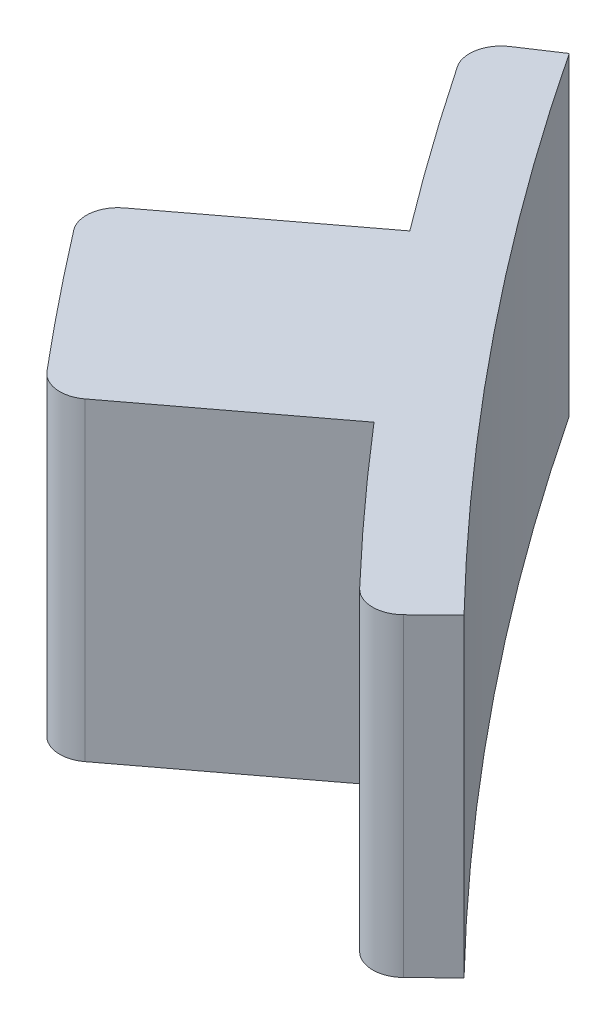
ISO-10303-21;
HEADER;
FILE_DESCRIPTION(('STEP AP214'),'2;1');
FILE_NAME('part.step','',(''),(''),'','','');
FILE_SCHEMA(('AUTOMOTIVE_DESIGN { 1 0 10303 214 1 1 1 1 }'));
ENDSEC;
DATA;
#1=APPLICATION_CONTEXT('core data for automotive mechanical design processes');
#2=APPLICATION_PROTOCOL_DEFINITION('international standard','automotive_design',2000,#1);
#3=PRODUCT_CONTEXT('',#1,'mechanical');
#4=PRODUCT('Part','Part','',(#3));
#5=PRODUCT_RELATED_PRODUCT_CATEGORY('part','',(#4));
#6=PRODUCT_DEFINITION_FORMATION('','',#4);
#7=PRODUCT_DEFINITION_CONTEXT('part definition',#1,'design');
#8=PRODUCT_DEFINITION('design','',#6,#7);
#9=PRODUCT_DEFINITION_SHAPE('','',#8);
#10=(LENGTH_UNIT() NAMED_UNIT(*) SI_UNIT(.MILLI.,.METRE.));
#11=(NAMED_UNIT(*) PLANE_ANGLE_UNIT() SI_UNIT($,.RADIAN.));
#12=(NAMED_UNIT(*) SI_UNIT($,.STERADIAN.) SOLID_ANGLE_UNIT());
#13=UNCERTAINTY_MEASURE_WITH_UNIT(LENGTH_MEASURE(1.E-05),#10,'distance_accuracy_value','');
#14=(GEOMETRIC_REPRESENTATION_CONTEXT(3) GLOBAL_UNCERTAINTY_ASSIGNED_CONTEXT((#13)) GLOBAL_UNIT_ASSIGNED_CONTEXT((#10,
#11,#12)) REPRESENTATION_CONTEXT('',''));
#15=CARTESIAN_POINT('',(0.,0.,0.));
#16=DIRECTION('',(0.,0.,1.));
#17=DIRECTION('',(1.,0.,0.));
#18=AXIS2_PLACEMENT_3D('',#15,#16,#17);
#19=CARTESIAN_POINT('',(1.68481362004538E-13,25.4,2.54615474717147E-13));
#20=DIRECTION('',(-0.551834617558189,0.,-0.833953568770113));
#21=DIRECTION('',(-0.833953568770113,0.,0.551834617558189));
#22=AXIS2_PLACEMENT_3D('',#19,#20,#21);
#23=PLANE('',#22);
#24=DIRECTION('',(0.833953568770113,0.,-0.551834617558189));
#25=VECTOR('',#24,1.);
#26=CARTESIAN_POINT('',(1.68481362004538E-13,0.,2.54615474717147E-13));
#27=LINE('',#26,#25);
#28=CARTESIAN_POINT('',(-253.720621889202,0.,167.889229796497));
#29=VERTEX_POINT('',#28);
#30=CARTESIAN_POINT('',(-250.831084414924,0.,165.977196720855));
#31=VERTEX_POINT('',#30);
#32=EDGE_CURVE('E164',#29,#31,#27,.T.);
#33=ORIENTED_EDGE('',*,*,#32,.F.);
#34=DIRECTION('',(0.,1.,0.));
#35=VECTOR('',#34,1.);
#36=CARTESIAN_POINT('',(-253.720621889202,25.4,167.889229796497));
#37=LINE('',#36,#35);
#38=CARTESIAN_POINT('',(-253.720621889202,25.4,167.889229796497));
#39=VERTEX_POINT('',#38);
#40=EDGE_CURVE('E208',#29,#39,#37,.T.);
#41=ORIENTED_EDGE('',*,*,#40,.T.);
#42=DIRECTION('',(0.833953568770113,0.,-0.551834617558189));
#43=VECTOR('',#42,1.);
#44=CARTESIAN_POINT('',(1.68481362004538E-13,25.4,2.54615474717147E-13));
#45=LINE('',#44,#43);
#46=CARTESIAN_POINT('',(-250.831084414924,25.4,165.977196720855));
#47=VERTEX_POINT('',#46);
#48=EDGE_CURVE('E133',#39,#47,#45,.T.);
#49=ORIENTED_EDGE('',*,*,#48,.T.);
#50=DIRECTION('',(0.,-1.,0.));
#51=VECTOR('',#50,1.);
#52=CARTESIAN_POINT('',(-250.831084414924,25.4,165.977196720855));
#53=LINE('',#52,#51);
#54=EDGE_CURVE('E163',#47,#31,#53,.T.);
#55=ORIENTED_EDGE('',*,*,#54,.T.);
#56=EDGE_LOOP('',(#33,#41,#49,#55));
#57=FACE_BOUND('',#56,.T.);
#58=ADVANCED_FACE('F32',(#57),#23,.T.);
#59=CARTESIAN_POINT('',(0.,25.4,0.));
#60=DIRECTION('',(0.,-1.,0.));
#61=DIRECTION('',(0.,0.,-1.));
#62=AXIS2_PLACEMENT_3D('',#59,#60,#61);
#63=CYLINDRICAL_SURFACE('',#62,306.788909699779);
#64=CARTESIAN_POINT('',(0.,25.4,0.));
#65=DIRECTION('',(0.,1.,0.));
#66=DIRECTION('',(0.,0.,1.));
#67=AXIS2_PLACEMENT_3D('',#64,#65,#66);
#68=CIRCLE('',#67,306.788909699779);
#69=CARTESIAN_POINT('',(-254.42542855078,25.4,171.426766934255));
#70=VERTEX_POINT('',#69);
#71=CARTESIAN_POINT('',(-244.848924973959,25.4,184.847069367831));
#72=VERTEX_POINT('',#71);
#73=EDGE_CURVE('E120',#70,#72,#68,.T.);
#74=ORIENTED_EDGE('',*,*,#73,.F.);
#75=DIRECTION('',(0.,-1.,0.));
#76=VECTOR('',#75,1.);
#77=CARTESIAN_POINT('',(-254.42542855078,25.4,171.426766934255));
#78=LINE('',#77,#76);
#79=CARTESIAN_POINT('',(-254.42542855078,0.,171.426766934255));
#80=VERTEX_POINT('',#79);
#81=EDGE_CURVE('E206',#70,#80,#78,.T.);
#82=ORIENTED_EDGE('',*,*,#81,.T.);
#83=CARTESIAN_POINT('',(0.,0.,0.));
#84=DIRECTION('',(0.,1.,0.));
#85=DIRECTION('',(0.,0.,1.));
#86=AXIS2_PLACEMENT_3D('',#83,#84,#85);
#87=CIRCLE('',#86,306.788909699779);
#88=CARTESIAN_POINT('',(-244.848924973959,0.,184.847069367831));
#89=VERTEX_POINT('',#88);
#90=EDGE_CURVE('E139',#80,#89,#87,.T.);
#91=ORIENTED_EDGE('',*,*,#90,.T.);
#92=DIRECTION('',(0.,-1.,0.));
#93=VECTOR('',#92,1.);
#94=CARTESIAN_POINT('',(-244.848924973959,25.4,184.847069367831));
#95=LINE('',#94,#93);
#96=EDGE_CURVE('E136',#72,#89,#95,.T.);
#97=ORIENTED_EDGE('',*,*,#96,.F.);
#98=EDGE_LOOP('',(#74,#82,#91,#97));
#99=FACE_BOUND('',#98,.T.);
#100=ADVANCED_FACE('F137',(#99),#63,.T.);
#101=CARTESIAN_POINT('',(0.,25.4,0.));
#102=DIRECTION('',(0.602522006250881,0.,0.798102269125589));
#103=DIRECTION('',(0.798102269125589,0.,-0.602522006250881));
#104=AXIS2_PLACEMENT_3D('',#101,#102,#103);
#105=PLANE('',#104);
#106=DIRECTION('',(-0.798102269125589,0.,0.602522006250881));
#107=VECTOR('',#106,1.);
#108=CARTESIAN_POINT('',(0.,0.,0.));
#109=LINE('',#108,#107);
#110=CARTESIAN_POINT('',(-258.016819612122,0.,194.788083950059));
#111=VERTEX_POINT('',#110);
#112=EDGE_CURVE('E167',#89,#111,#109,.T.);
#113=ORIENTED_EDGE('',*,*,#112,.T.);
#114=DIRECTION('',(0.,-1.,0.));
#115=VECTOR('',#114,1.);
#116=CARTESIAN_POINT('',(-258.016819612122,25.4,194.788083950059));
#117=LINE('',#116,#115);
#118=CARTESIAN_POINT('',(-258.016819612122,25.4,194.788083950059));
#119=VERTEX_POINT('',#118);
#120=EDGE_CURVE('E11',#111,#119,#117,.F.);
#121=ORIENTED_EDGE('',*,*,#120,.T.);
#122=DIRECTION('',(-0.798102269125589,0.,0.602522006250881));
#123=VECTOR('',#122,1.);
#124=CARTESIAN_POINT('',(0.,25.4,0.));
#125=LINE('',#124,#123);
#126=EDGE_CURVE('E125',#72,#119,#125,.T.);
#127=ORIENTED_EDGE('',*,*,#126,.F.);
#128=ORIENTED_EDGE('',*,*,#96,.T.);
#129=EDGE_LOOP('',(#113,#121,#127,#128));
#130=FACE_BOUND('',#129,.T.);
#131=ADVANCED_FACE('F146',(#130),#105,.F.);
#132=CARTESIAN_POINT('',(0.,25.4,0.));
#133=DIRECTION('',(0.,-1.,0.));
#134=DIRECTION('',(0.,0.,-1.));
#135=AXIS2_PLACEMENT_3D('',#132,#133,#134);
#136=CYLINDRICAL_SURFACE('',#135,325.837894288981);
#137=CARTESIAN_POINT('',(0.,0.,0.));
#138=DIRECTION('',(0.,1.,0.));
#139=DIRECTION('',(0.,0.,1.));
#140=AXIS2_PLACEMENT_3D('',#137,#138,#139);
#141=CIRCLE('',#140,325.837894288981);
#142=CARTESIAN_POINT('',(-258.501507233238,0.,198.361548977673));
#143=VERTEX_POINT('',#142);
#144=CARTESIAN_POINT('',(-249.693891681859,0.,209.340139035603));
#145=VERTEX_POINT('',#144);
#146=EDGE_CURVE('E169',#143,#145,#141,.T.);
#147=ORIENTED_EDGE('',*,*,#146,.T.);
#148=DIRECTION('',(0.,-1.,0.));
#149=VECTOR('',#148,1.);
#150=CARTESIAN_POINT('',(-249.693891681859,25.4,209.340139035603));
#151=LINE('',#150,#149);
#152=CARTESIAN_POINT('',(-249.693891681859,25.4,209.340139035603));
#153=VERTEX_POINT('',#152);
#154=EDGE_CURVE('E40',#145,#153,#151,.F.);
#155=ORIENTED_EDGE('',*,*,#154,.T.);
#156=CARTESIAN_POINT('',(0.,25.4,0.));
#157=DIRECTION('',(0.,1.,0.));
#158=DIRECTION('',(0.,0.,1.));
#159=AXIS2_PLACEMENT_3D('',#156,#157,#158);
#160=CIRCLE('',#159,325.837894288981);
#161=CARTESIAN_POINT('',(-258.501507233238,25.4,198.361548977673));
#162=VERTEX_POINT('',#161);
#163=EDGE_CURVE('E148',#162,#153,#160,.T.);
#164=ORIENTED_EDGE('',*,*,#163,.F.);
#165=DIRECTION('',(0.,-1.,0.));
#166=VECTOR('',#165,1.);
#167=CARTESIAN_POINT('',(-258.501507233238,25.4,198.361548977673));
#168=LINE('',#167,#166);
#169=EDGE_CURVE('E213',#162,#143,#168,.T.);
#170=ORIENTED_EDGE('',*,*,#169,.T.);
#171=EDGE_LOOP('',(#147,#155,#164,#170));
#172=FACE_BOUND('',#171,.T.);
#173=ADVANCED_FACE('F217',(#172),#136,.T.);
#174=CARTESIAN_POINT('',(11.4715064556953,25.4,15.1951882878898));
#175=DIRECTION('',(-0.602522006250881,0.,-0.798102269125589));
#176=DIRECTION('',(-0.798102269125589,0.,0.602522006250881));
#177=AXIS2_PLACEMENT_3D('',#174,#175,#176);
#178=PLANE('',#177);
#179=DIRECTION('',(0.798102269125589,0.,-0.602522006250881));
#180=VECTOR('',#179,1.);
#181=CARTESIAN_POINT('',(11.4715064556953,25.4,15.1951882878898));
#182=LINE('',#181,#180);
#183=CARTESIAN_POINT('',(-246.217050162661,25.4,209.735452271469));
#184=VERTEX_POINT('',#183);
#185=CARTESIAN_POINT('',(-232.9054611861,25.4,199.685956603036));
#186=VERTEX_POINT('',#185);
#187=EDGE_CURVE('E150',#184,#186,#182,.T.);
#188=ORIENTED_EDGE('',*,*,#187,.F.);
#189=DIRECTION('',(0.,-1.,0.));
#190=VECTOR('',#189,1.);
#191=CARTESIAN_POINT('',(-246.217050162661,25.4,209.735452271469));
#192=LINE('',#191,#190);
#193=CARTESIAN_POINT('',(-246.217050162661,0.,209.735452271469));
#194=VERTEX_POINT('',#193);
#195=EDGE_CURVE('E210',#184,#194,#192,.T.);
#196=ORIENTED_EDGE('',*,*,#195,.T.);
#197=DIRECTION('',(0.798102269125589,0.,-0.602522006250881));
#198=VECTOR('',#197,1.);
#199=CARTESIAN_POINT('',(11.4715064556953,0.,15.1951882878898));
#200=LINE('',#199,#198);
#201=CARTESIAN_POINT('',(-232.9054611861,0.,199.685956603036));
#202=VERTEX_POINT('',#201);
#203=EDGE_CURVE('E171',#194,#202,#200,.T.);
#204=ORIENTED_EDGE('',*,*,#203,.T.);
#205=DIRECTION('',(0.,-1.,0.));
#206=VECTOR('',#205,1.);
#207=CARTESIAN_POINT('',(-232.9054611861,25.4,199.685956603036));
#208=LINE('',#207,#206);
#209=EDGE_CURVE('E144',#186,#202,#208,.T.);
#210=ORIENTED_EDGE('',*,*,#209,.F.);
#211=EDGE_LOOP('',(#188,#196,#204,#210));
#212=FACE_BOUND('',#211,.T.);
#213=ADVANCED_FACE('F227',(#212),#178,.F.);
#214=CARTESIAN_POINT('',(0.,25.4,0.));
#215=DIRECTION('',(0.,-1.,0.));
#216=DIRECTION('',(0.,0.,-1.));
#217=AXIS2_PLACEMENT_3D('',#214,#215,#216);
#218=CYLINDRICAL_SURFACE('',#217,306.788909699779);
#219=CARTESIAN_POINT('',(0.,0.,0.));
#220=DIRECTION('',(0.,1.,0.));
#221=DIRECTION('',(0.,0.,1.));
#222=AXIS2_PLACEMENT_3D('',#219,#220,#221);
#223=CIRCLE('',#222,306.788909699779);
#224=CARTESIAN_POINT('',(-221.841936664459,0.,211.909391608163));
#225=VERTEX_POINT('',#224);
#226=EDGE_CURVE('E173',#202,#225,#223,.T.);
#227=ORIENTED_EDGE('',*,*,#226,.T.);
#228=DIRECTION('',(0.,-1.,0.));
#229=VECTOR('',#228,1.);
#230=CARTESIAN_POINT('',(-221.841936664459,25.4,211.909391608163));
#231=LINE('',#230,#229);
#232=CARTESIAN_POINT('',(-221.841936664459,25.4,211.909391608163));
#233=VERTEX_POINT('',#232);
#234=EDGE_CURVE('E198',#225,#233,#231,.F.);
#235=ORIENTED_EDGE('',*,*,#234,.T.);
#236=CARTESIAN_POINT('',(0.,25.4,0.));
#237=DIRECTION('',(0.,1.,0.));
#238=DIRECTION('',(0.,0.,1.));
#239=AXIS2_PLACEMENT_3D('',#236,#237,#238);
#240=CIRCLE('',#239,306.788909699779);
#241=EDGE_CURVE('E155',#186,#233,#240,.T.);
#242=ORIENTED_EDGE('',*,*,#241,.F.);
#243=ORIENTED_EDGE('',*,*,#209,.T.);
#244=EDGE_LOOP('',(#227,#235,#242,#243));
#245=FACE_BOUND('',#244,.T.);
#246=ADVANCED_FACE('F315',(#245),#218,.T.);
#247=CARTESIAN_POINT('',(0.,25.4,0.));
#248=DIRECTION('',(0.696746301536442,0.,0.717317636263943));
#249=DIRECTION('',(0.717317636263943,0.,-0.696746301536442));
#250=AXIS2_PLACEMENT_3D('',#247,#248,#249);
#251=PLANE('',#250);
#252=DIRECTION('',(-0.717317636263943,0.,0.696746301536442));
#253=VECTOR('',#252,1.);
#254=CARTESIAN_POINT('',(0.,25.4,0.));
#255=LINE('',#254,#253);
#256=CARTESIAN_POINT('',(-215.750093664547,25.4,209.562782535018));
#257=VERTEX_POINT('',#256);
#258=CARTESIAN_POINT('',(-218.235503246764,25.4,211.976915196293));
#259=VERTEX_POINT('',#258);
#260=EDGE_CURVE('E157',#257,#259,#255,.T.);
#261=ORIENTED_EDGE('',*,*,#260,.T.);
#262=DIRECTION('',(0.,1.,0.));
#263=VECTOR('',#262,1.);
#264=CARTESIAN_POINT('',(-218.235503246764,0.,211.976915196293));
#265=LINE('',#264,#263);
#266=CARTESIAN_POINT('',(-218.235503246764,0.,211.976915196293));
#267=VERTEX_POINT('',#266);
#268=EDGE_CURVE('E143',#259,#267,#265,.F.);
#269=ORIENTED_EDGE('',*,*,#268,.T.);
#270=DIRECTION('',(-0.717317636263943,0.,0.696746301536442));
#271=VECTOR('',#270,1.);
#272=CARTESIAN_POINT('',(0.,0.,0.));
#273=LINE('',#272,#271);
#274=CARTESIAN_POINT('',(-215.750093664547,0.,209.562782535018));
#275=VERTEX_POINT('',#274);
#276=EDGE_CURVE('E176',#275,#267,#273,.T.);
#277=ORIENTED_EDGE('',*,*,#276,.F.);
#278=DIRECTION('',(0.,-1.,0.));
#279=VECTOR('',#278,1.);
#280=CARTESIAN_POINT('',(-215.750093664547,25.4,209.562782535018));
#281=LINE('',#280,#279);
#282=EDGE_CURVE('E184',#257,#275,#281,.T.);
#283=ORIENTED_EDGE('',*,*,#282,.F.);
#284=EDGE_LOOP('',(#261,#269,#277,#283));
#285=FACE_BOUND('',#284,.T.);
#286=ADVANCED_FACE('F239',(#285),#251,.T.);
#287=CARTESIAN_POINT('',(0.,25.4,0.));
#288=DIRECTION('',(0.,-1.,0.));
#289=DIRECTION('',(0.,0.,-1.));
#290=AXIS2_PLACEMENT_3D('',#287,#288,#289);
#291=CYLINDRICAL_SURFACE('',#290,300.773440882137);
#292=CARTESIAN_POINT('',(0.,0.,0.));
#293=DIRECTION('',(0.,1.,0.));
#294=DIRECTION('',(0.,0.,1.));
#295=AXIS2_PLACEMENT_3D('',#292,#293,#294);
#296=CIRCLE('',#295,300.773440882137);
#297=EDGE_CURVE('E179',#31,#275,#296,.T.);
#298=ORIENTED_EDGE('',*,*,#297,.F.);
#299=ORIENTED_EDGE('',*,*,#54,.F.);
#300=CARTESIAN_POINT('',(0.,25.4,0.));
#301=DIRECTION('',(0.,1.,0.));
#302=DIRECTION('',(0.,0.,1.));
#303=AXIS2_PLACEMENT_3D('',#300,#301,#302);
#304=CIRCLE('',#303,300.773440882137);
#305=EDGE_CURVE('E160',#47,#257,#304,.T.);
#306=ORIENTED_EDGE('',*,*,#305,.T.);
#307=ORIENTED_EDGE('',*,*,#282,.T.);
#308=EDGE_LOOP('',(#298,#299,#306,#307));
#309=FACE_BOUND('',#308,.T.);
#310=ADVANCED_FACE('F244',(#309),#291,.F.);
#311=CARTESIAN_POINT('',(0.,25.4,0.));
#312=DIRECTION('',(0.,1.,0.));
#313=DIRECTION('',(0.,0.,1.));
#314=AXIS2_PLACEMENT_3D('',#311,#312,#313);
#315=PLANE('',#314);
#316=ORIENTED_EDGE('',*,*,#241,.T.);
#317=CARTESIAN_POINT('',(-220.005238852666,25.4,210.154928400182));
#318=DIRECTION('',(0.,1.,0.));
#319=DIRECTION('',(0.,0.,1.));
#320=AXIS2_PLACEMENT_3D('',#317,#318,#319);
#321=CIRCLE('',#320,2.54);
#322=EDGE_CURVE('E204',#233,#259,#321,.T.);
#323=ORIENTED_EDGE('',*,*,#322,.T.);
#324=ORIENTED_EDGE('',*,*,#260,.F.);
#325=ORIENTED_EDGE('',*,*,#305,.F.);
#326=ORIENTED_EDGE('',*,*,#48,.F.);
#327=CARTESIAN_POINT('',(-252.318961960604,25.4,170.007471861173));
#328=DIRECTION('',(0.,1.,0.));
#329=DIRECTION('',(0.,0.,1.));
#330=AXIS2_PLACEMENT_3D('',#327,#328,#329);
#331=CIRCLE('',#330,2.54);
#332=EDGE_CURVE('E129',#39,#70,#331,.T.);
#333=ORIENTED_EDGE('',*,*,#332,.T.);
#334=ORIENTED_EDGE('',*,*,#73,.T.);
#335=ORIENTED_EDGE('',*,*,#126,.T.);
#336=CARTESIAN_POINT('',(-256.486413716245,25.4,196.815263713638));
#337=DIRECTION('',(0.,1.,0.));
#338=DIRECTION('',(0.,0.,1.));
#339=AXIS2_PLACEMENT_3D('',#336,#337,#338);
#340=CIRCLE('',#339,2.54);
#341=EDGE_CURVE('E200',#119,#162,#340,.T.);
#342=ORIENTED_EDGE('',*,*,#341,.T.);
#343=ORIENTED_EDGE('',*,*,#163,.T.);
#344=CARTESIAN_POINT('',(-247.747456058538,25.4,207.70827250789));
#345=DIRECTION('',(0.,1.,0.));
#346=DIRECTION('',(0.,0.,1.));
#347=AXIS2_PLACEMENT_3D('',#344,#345,#346);
#348=CIRCLE('',#347,2.54);
#349=EDGE_CURVE('E47',#153,#184,#348,.T.);
#350=ORIENTED_EDGE('',*,*,#349,.T.);
#351=ORIENTED_EDGE('',*,*,#187,.T.);
#352=EDGE_LOOP('',(#316,#323,#324,#325,#326,#333,#334,#335,#342,#343,#350,#351));
#353=FACE_BOUND('',#352,.T.);
#354=ADVANCED_FACE('F123',(#353),#315,.T.);
#355=CARTESIAN_POINT('',(0.,0.,0.));
#356=DIRECTION('',(0.,1.,0.));
#357=DIRECTION('',(0.,0.,1.));
#358=AXIS2_PLACEMENT_3D('',#355,#356,#357);
#359=PLANE('',#358);
#360=ORIENTED_EDGE('',*,*,#276,.T.);
#361=CARTESIAN_POINT('',(-220.005238852666,0.,210.154928400182));
#362=DIRECTION('',(0.,1.,0.));
#363=DIRECTION('',(0.,0.,1.));
#364=AXIS2_PLACEMENT_3D('',#361,#362,#363);
#365=CIRCLE('',#364,2.54);
#366=EDGE_CURVE('E196',#267,#225,#365,.F.);
#367=ORIENTED_EDGE('',*,*,#366,.T.);
#368=ORIENTED_EDGE('',*,*,#226,.F.);
#369=ORIENTED_EDGE('',*,*,#203,.F.);
#370=CARTESIAN_POINT('',(-247.747456058538,0.,207.70827250789));
#371=DIRECTION('',(0.,1.,0.));
#372=DIRECTION('',(0.,0.,1.));
#373=AXIS2_PLACEMENT_3D('',#370,#371,#372);
#374=CIRCLE('',#373,2.54);
#375=EDGE_CURVE('E192',#194,#145,#374,.F.);
#376=ORIENTED_EDGE('',*,*,#375,.T.);
#377=ORIENTED_EDGE('',*,*,#146,.F.);
#378=CARTESIAN_POINT('',(-256.486413716245,0.,196.815263713638));
#379=DIRECTION('',(0.,1.,0.));
#380=DIRECTION('',(0.,0.,1.));
#381=AXIS2_PLACEMENT_3D('',#378,#379,#380);
#382=CIRCLE('',#381,2.54);
#383=EDGE_CURVE('E190',#143,#111,#382,.F.);
#384=ORIENTED_EDGE('',*,*,#383,.T.);
#385=ORIENTED_EDGE('',*,*,#112,.F.);
#386=ORIENTED_EDGE('',*,*,#90,.F.);
#387=CARTESIAN_POINT('',(-252.318961960604,0.,170.007471861173));
#388=DIRECTION('',(0.,1.,0.));
#389=DIRECTION('',(0.,0.,1.));
#390=AXIS2_PLACEMENT_3D('',#387,#388,#389);
#391=CIRCLE('',#390,2.54);
#392=EDGE_CURVE('E194',#80,#29,#391,.F.);
#393=ORIENTED_EDGE('',*,*,#392,.T.);
#394=ORIENTED_EDGE('',*,*,#32,.T.);
#395=ORIENTED_EDGE('',*,*,#297,.T.);
#396=EDGE_LOOP('',(#360,#367,#368,#369,#376,#377,#384,#385,#386,#393,#394,#395));
#397=FACE_BOUND('',#396,.T.);
#398=ADVANCED_FACE('F220',(#397),#359,.F.);
#399=CARTESIAN_POINT('',(-220.005238852666,25.4,210.154928400182));
#400=DIRECTION('',(0.,-1.,0.));
#401=DIRECTION('',(0.,0.,-1.));
#402=AXIS2_PLACEMENT_3D('',#399,#400,#401);
#403=CYLINDRICAL_SURFACE('',#402,2.54);
#404=ORIENTED_EDGE('',*,*,#322,.F.);
#405=ORIENTED_EDGE('',*,*,#234,.F.);
#406=ORIENTED_EDGE('',*,*,#366,.F.);
#407=ORIENTED_EDGE('',*,*,#268,.F.);
#408=EDGE_LOOP('',(#404,#405,#406,#407));
#409=FACE_BOUND('',#408,.T.);
#410=ADVANCED_FACE('F236',(#409),#403,.T.);
#411=CARTESIAN_POINT('',(-252.318961960604,25.4,170.007471861173));
#412=DIRECTION('',(0.,-1.,0.));
#413=DIRECTION('',(0.,0.,-1.));
#414=AXIS2_PLACEMENT_3D('',#411,#412,#413);
#415=CYLINDRICAL_SURFACE('',#414,2.54);
#416=ORIENTED_EDGE('',*,*,#332,.F.);
#417=ORIENTED_EDGE('',*,*,#40,.F.);
#418=ORIENTED_EDGE('',*,*,#392,.F.);
#419=ORIENTED_EDGE('',*,*,#81,.F.);
#420=EDGE_LOOP('',(#416,#417,#418,#419));
#421=FACE_BOUND('',#420,.T.);
#422=ADVANCED_FACE('F249',(#421),#415,.T.);
#423=CARTESIAN_POINT('',(-247.747456058538,25.4,207.70827250789));
#424=DIRECTION('',(0.,-1.,0.));
#425=DIRECTION('',(0.,0.,-1.));
#426=AXIS2_PLACEMENT_3D('',#423,#424,#425);
#427=CYLINDRICAL_SURFACE('',#426,2.54);
#428=ORIENTED_EDGE('',*,*,#349,.F.);
#429=ORIENTED_EDGE('',*,*,#154,.F.);
#430=ORIENTED_EDGE('',*,*,#375,.F.);
#431=ORIENTED_EDGE('',*,*,#195,.F.);
#432=EDGE_LOOP('',(#428,#429,#430,#431));
#433=FACE_BOUND('',#432,.T.);
#434=ADVANCED_FACE('F225',(#433),#427,.T.);
#435=CARTESIAN_POINT('',(-256.486413716245,25.4,196.815263713638));
#436=DIRECTION('',(0.,-1.,0.));
#437=DIRECTION('',(0.,0.,-1.));
#438=AXIS2_PLACEMENT_3D('',#435,#436,#437);
#439=CYLINDRICAL_SURFACE('',#438,2.54);
#440=ORIENTED_EDGE('',*,*,#341,.F.);
#441=ORIENTED_EDGE('',*,*,#120,.F.);
#442=ORIENTED_EDGE('',*,*,#383,.F.);
#443=ORIENTED_EDGE('',*,*,#169,.F.);
#444=EDGE_LOOP('',(#440,#441,#442,#443));
#445=FACE_BOUND('',#444,.T.);
#446=ADVANCED_FACE('F34',(#445),#439,.T.);
#447=CLOSED_SHELL('',(#58,#100,#131,#173,#213,#246,#286,#310,#354,#398,#410,#422,#434,#446));
#448=MANIFOLD_SOLID_BREP('B2',#447);
#449=ADVANCED_BREP_SHAPE_REPRESENTATION('',(#18,#448),#14);
#450=SHAPE_DEFINITION_REPRESENTATION(#9,#449);
ENDSEC;
END-ISO-10303-21;
